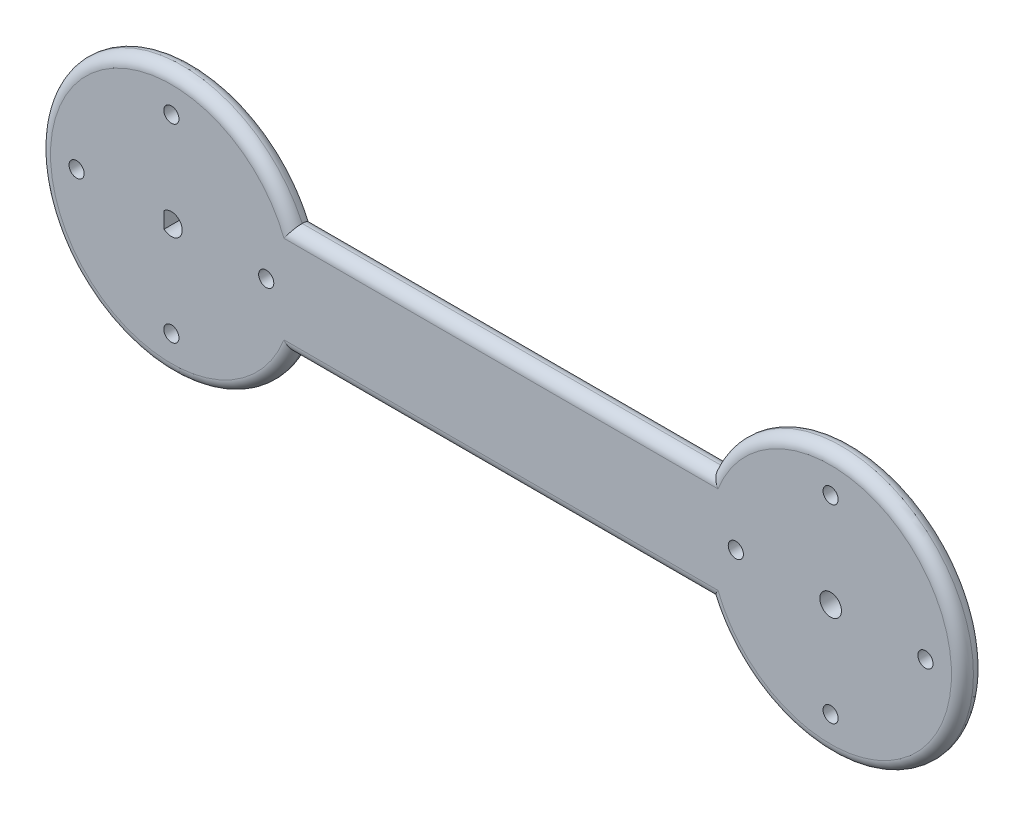
ISO-10303-21;
HEADER;
FILE_DESCRIPTION(('STEP AP214'),'2;1');
FILE_NAME('part.step','',(''),(''),'','','');
FILE_SCHEMA(('AUTOMOTIVE_DESIGN { 1 0 10303 214 1 1 1 1 }'));
ENDSEC;
DATA;
#1=APPLICATION_CONTEXT('core data for automotive mechanical design processes');
#2=APPLICATION_PROTOCOL_DEFINITION('international standard','automotive_design',2000,#1);
#3=PRODUCT_CONTEXT('',#1,'mechanical');
#4=PRODUCT('Part','Part','',(#3));
#5=PRODUCT_RELATED_PRODUCT_CATEGORY('part','',(#4));
#6=PRODUCT_DEFINITION_FORMATION('','',#4);
#7=PRODUCT_DEFINITION_CONTEXT('part definition',#1,'design');
#8=PRODUCT_DEFINITION('design','',#6,#7);
#9=PRODUCT_DEFINITION_SHAPE('','',#8);
#10=(LENGTH_UNIT() NAMED_UNIT(*) SI_UNIT(.MILLI.,.METRE.));
#11=(NAMED_UNIT(*) PLANE_ANGLE_UNIT() SI_UNIT($,.RADIAN.));
#12=(NAMED_UNIT(*) SI_UNIT($,.STERADIAN.) SOLID_ANGLE_UNIT());
#13=UNCERTAINTY_MEASURE_WITH_UNIT(LENGTH_MEASURE(1.E-05),#10,'distance_accuracy_value','');
#14=(GEOMETRIC_REPRESENTATION_CONTEXT(3) GLOBAL_UNCERTAINTY_ASSIGNED_CONTEXT((#13)) GLOBAL_UNIT_ASSIGNED_CONTEXT((#10,
#11,#12)) REPRESENTATION_CONTEXT('',''));
#15=CARTESIAN_POINT('',(0.,0.,0.));
#16=DIRECTION('',(0.,0.,1.));
#17=DIRECTION('',(1.,0.,0.));
#18=AXIS2_PLACEMENT_3D('',#15,#16,#17);
#19=CARTESIAN_POINT('',(152.4,0.,5.08));
#20=DIRECTION('',(0.,0.,1.));
#21=DIRECTION('',(1.,0.,0.));
#22=AXIS2_PLACEMENT_3D('',#19,#20,#21);
#23=PLANE('',#22);
#24=CARTESIAN_POINT('',(130.479689783217,0.,5.08));
#25=DIRECTION('',(0.,0.,-1.));
#26=DIRECTION('',(-1.,0.,0.));
#27=AXIS2_PLACEMENT_3D('',#24,#25,#26);
#28=CIRCLE('',#27,1.75000000000001);
#29=CARTESIAN_POINT('',(128.729689783217,0.,5.08));
#30=VERTEX_POINT('',#29);
#31=EDGE_CURVE('E307',#30,#30,#28,.T.);
#32=ORIENTED_EDGE('',*,*,#31,.T.);
#33=EDGE_LOOP('',(#32));
#34=FACE_BOUND('',#33,.T.);
#35=CARTESIAN_POINT('',(152.4,-21.920310216783,5.08));
#36=DIRECTION('',(0.,0.,-1.));
#37=DIRECTION('',(-1.,0.,0.));
#38=AXIS2_PLACEMENT_3D('',#35,#36,#37);
#39=CIRCLE('',#38,1.75);
#40=CARTESIAN_POINT('',(150.65,-21.920310216783,5.08));
#41=VERTEX_POINT('',#40);
#42=EDGE_CURVE('E315',#41,#41,#39,.T.);
#43=ORIENTED_EDGE('',*,*,#42,.T.);
#44=EDGE_LOOP('',(#43));
#45=FACE_BOUND('',#44,.T.);
#46=CARTESIAN_POINT('',(174.320310216783,1.530687081271E-13,5.08));
#47=DIRECTION('',(0.,0.,-1.));
#48=DIRECTION('',(-1.,0.,0.));
#49=AXIS2_PLACEMENT_3D('',#46,#47,#48);
#50=CIRCLE('',#49,1.75000000000001);
#51=CARTESIAN_POINT('',(172.570310216783,1.530687081271E-13,5.08));
#52=VERTEX_POINT('',#51);
#53=EDGE_CURVE('E323',#52,#52,#50,.T.);
#54=ORIENTED_EDGE('',*,*,#53,.T.);
#55=EDGE_LOOP('',(#54));
#56=FACE_BOUND('',#55,.T.);
#57=CARTESIAN_POINT('',(152.4,21.920310216783,5.08));
#58=DIRECTION('',(0.,0.,-1.));
#59=DIRECTION('',(-1.,0.,0.));
#60=AXIS2_PLACEMENT_3D('',#57,#58,#59);
#61=CIRCLE('',#60,1.75);
#62=CARTESIAN_POINT('',(150.65,21.920310216783,5.08));
#63=VERTEX_POINT('',#62);
#64=EDGE_CURVE('E331',#63,#63,#61,.T.);
#65=ORIENTED_EDGE('',*,*,#64,.T.);
#66=EDGE_LOOP('',(#65));
#67=FACE_BOUND('',#66,.T.);
#68=CARTESIAN_POINT('',(21.920310216783,0.,5.08));
#69=DIRECTION('',(0.,0.,1.));
#70=DIRECTION('',(1.,0.,0.));
#71=AXIS2_PLACEMENT_3D('',#68,#69,#70);
#72=CIRCLE('',#71,1.75000000000001);
#73=CARTESIAN_POINT('',(23.670310216783,0.,5.08));
#74=VERTEX_POINT('',#73);
#75=EDGE_CURVE('E278',#74,#74,#72,.T.);
#76=ORIENTED_EDGE('',*,*,#75,.F.);
#77=EDGE_LOOP('',(#76));
#78=FACE_BOUND('',#77,.T.);
#79=CARTESIAN_POINT('',(0.,-21.920310216783,5.08));
#80=DIRECTION('',(0.,0.,1.));
#81=DIRECTION('',(1.,0.,0.));
#82=AXIS2_PLACEMENT_3D('',#79,#80,#81);
#83=CIRCLE('',#82,1.75);
#84=CARTESIAN_POINT('',(1.74999999999992,-21.920310216783,5.08));
#85=VERTEX_POINT('',#84);
#86=EDGE_CURVE('E282',#85,#85,#83,.T.);
#87=ORIENTED_EDGE('',*,*,#86,.F.);
#88=EDGE_LOOP('',(#87));
#89=FACE_BOUND('',#88,.T.);
#90=CARTESIAN_POINT('',(-21.920310216783,1.530687081271E-13,5.08));
#91=DIRECTION('',(0.,0.,1.));
#92=DIRECTION('',(1.,0.,0.));
#93=AXIS2_PLACEMENT_3D('',#90,#91,#92);
#94=CIRCLE('',#93,1.75000000000001);
#95=CARTESIAN_POINT('',(-20.170310216783,1.530687081271E-13,5.08));
#96=VERTEX_POINT('',#95);
#97=EDGE_CURVE('E290',#96,#96,#94,.T.);
#98=ORIENTED_EDGE('',*,*,#97,.F.);
#99=EDGE_LOOP('',(#98));
#100=FACE_BOUND('',#99,.T.);
#101=CARTESIAN_POINT('',(2.16675014681188E-13,21.920310216783,5.08));
#102=DIRECTION('',(0.,0.,1.));
#103=DIRECTION('',(1.,0.,0.));
#104=AXIS2_PLACEMENT_3D('',#101,#102,#103);
#105=CIRCLE('',#104,1.75);
#106=CARTESIAN_POINT('',(1.75000000000022,21.920310216783,5.08));
#107=VERTEX_POINT('',#106);
#108=EDGE_CURVE('E298',#107,#107,#105,.T.);
#109=ORIENTED_EDGE('',*,*,#108,.F.);
#110=EDGE_LOOP('',(#109));
#111=FACE_BOUND('',#110,.T.);
#112=DIRECTION('',(-1.,0.,0.));
#113=VECTOR('',#112,1.);
#114=CARTESIAN_POINT('',(27.7081287711747,10.16,5.08));
#115=LINE('',#114,#113);
#116=CARTESIAN_POINT('',(126.372745054463,10.16,5.08));
#117=VERTEX_POINT('',#116);
#118=CARTESIAN_POINT('',(26.0272549455374,10.16,5.08));
#119=VERTEX_POINT('',#118);
#120=EDGE_CURVE('E162',#117,#119,#115,.T.);
#121=ORIENTED_EDGE('',*,*,#120,.T.);
#122=CARTESIAN_POINT('',(0.,0.,5.08));
#123=DIRECTION('',(0.,0.,1.));
#124=DIRECTION('',(1.,0.,0.));
#125=AXIS2_PLACEMENT_3D('',#122,#123,#124);
#126=CIRCLE('',#125,27.94);
#127=CARTESIAN_POINT('',(26.0272549455374,-10.16,5.08));
#128=VERTEX_POINT('',#127);
#129=EDGE_CURVE('E168',#119,#128,#126,.T.);
#130=ORIENTED_EDGE('',*,*,#129,.T.);
#131=DIRECTION('',(1.,0.,0.));
#132=VECTOR('',#131,1.);
#133=CARTESIAN_POINT('',(124.691871228825,-10.16,5.08));
#134=LINE('',#133,#132);
#135=CARTESIAN_POINT('',(126.372745054463,-10.16,5.08));
#136=VERTEX_POINT('',#135);
#137=EDGE_CURVE('E165',#128,#136,#134,.T.);
#138=ORIENTED_EDGE('',*,*,#137,.T.);
#139=CARTESIAN_POINT('',(152.4,0.,5.08));
#140=DIRECTION('',(0.,0.,1.));
#141=DIRECTION('',(1.,0.,0.));
#142=AXIS2_PLACEMENT_3D('',#139,#140,#141);
#143=CIRCLE('',#142,27.94);
#144=EDGE_CURVE('E156',#136,#117,#143,.T.);
#145=ORIENTED_EDGE('',*,*,#144,.T.);
#146=EDGE_LOOP('',(#121,#130,#138,#145));
#147=FACE_BOUND('',#146,.T.);
#148=CARTESIAN_POINT('',(152.4,0.,5.08));
#149=DIRECTION('',(0.,0.,1.));
#150=DIRECTION('',(1.,0.,0.));
#151=AXIS2_PLACEMENT_3D('',#148,#149,#150);
#152=CIRCLE('',#151,2.5019);
#153=CARTESIAN_POINT('',(154.9019,0.,5.08));
#154=VERTEX_POINT('',#153);
#155=EDGE_CURVE('E152',#154,#154,#152,.T.);
#156=ORIENTED_EDGE('',*,*,#155,.F.);
#157=EDGE_LOOP('',(#156));
#158=FACE_BOUND('',#157,.T.);
#159=DIRECTION('',(0.,-1.,0.));
#160=VECTOR('',#159,1.);
#161=CARTESIAN_POINT('',(-1.67829282995991,1.855488288,5.08));
#162=LINE('',#161,#160);
#163=CARTESIAN_POINT('',(-1.6782928299599,1.855488288,5.08));
#164=VERTEX_POINT('',#163);
#165=CARTESIAN_POINT('',(-1.67829282995991,-1.855488288,5.08));
#166=VERTEX_POINT('',#165);
#167=EDGE_CURVE('E118',#164,#166,#162,.T.);
#168=ORIENTED_EDGE('',*,*,#167,.F.);
#169=CARTESIAN_POINT('',(0.,0.,5.08));
#170=DIRECTION('',(0.,0.,1.));
#171=DIRECTION('',(1.,0.,0.));
#172=AXIS2_PLACEMENT_3D('',#169,#170,#171);
#173=CIRCLE('',#172,2.5019);
#174=EDGE_CURVE('E129',#166,#164,#173,.T.);
#175=ORIENTED_EDGE('',*,*,#174,.F.);
#176=EDGE_LOOP('',(#168,#175));
#177=FACE_BOUND('',#176,.T.);
#178=ADVANCED_FACE('F45',(#34,#45,#56,#67,#78,#89,#100,#111,#147,#158,#177),#23,.T.);
#179=CARTESIAN_POINT('',(152.4,0.,0.));
#180=DIRECTION('',(0.,0.,1.));
#181=DIRECTION('',(1.,0.,0.));
#182=AXIS2_PLACEMENT_3D('',#179,#180,#181);
#183=PLANE('',#182);
#184=CARTESIAN_POINT('',(130.479689783217,0.,0.));
#185=DIRECTION('',(0.,0.,-1.));
#186=DIRECTION('',(-1.,0.,0.));
#187=AXIS2_PLACEMENT_3D('',#184,#185,#186);
#188=CIRCLE('',#187,1.75000000000001);
#189=CARTESIAN_POINT('',(128.729689783217,0.,0.));
#190=VERTEX_POINT('',#189);
#191=EDGE_CURVE('E304',#190,#190,#188,.T.);
#192=ORIENTED_EDGE('',*,*,#191,.F.);
#193=EDGE_LOOP('',(#192));
#194=FACE_BOUND('',#193,.T.);
#195=CARTESIAN_POINT('',(152.4,-21.920310216783,0.));
#196=DIRECTION('',(0.,0.,-1.));
#197=DIRECTION('',(-1.,0.,0.));
#198=AXIS2_PLACEMENT_3D('',#195,#196,#197);
#199=CIRCLE('',#198,1.75);
#200=CARTESIAN_POINT('',(150.65,-21.920310216783,0.));
#201=VERTEX_POINT('',#200);
#202=EDGE_CURVE('E311',#201,#201,#199,.T.);
#203=ORIENTED_EDGE('',*,*,#202,.F.);
#204=EDGE_LOOP('',(#203));
#205=FACE_BOUND('',#204,.T.);
#206=CARTESIAN_POINT('',(174.320310216783,1.530687081271E-13,0.));
#207=DIRECTION('',(0.,0.,-1.));
#208=DIRECTION('',(-1.,0.,0.));
#209=AXIS2_PLACEMENT_3D('',#206,#207,#208);
#210=CIRCLE('',#209,1.75000000000001);
#211=CARTESIAN_POINT('',(172.570310216783,1.530687081271E-13,0.));
#212=VERTEX_POINT('',#211);
#213=EDGE_CURVE('E319',#212,#212,#210,.T.);
#214=ORIENTED_EDGE('',*,*,#213,.F.);
#215=EDGE_LOOP('',(#214));
#216=FACE_BOUND('',#215,.T.);
#217=CARTESIAN_POINT('',(152.4,21.920310216783,0.));
#218=DIRECTION('',(0.,0.,-1.));
#219=DIRECTION('',(-1.,0.,0.));
#220=AXIS2_PLACEMENT_3D('',#217,#218,#219);
#221=CIRCLE('',#220,1.75);
#222=CARTESIAN_POINT('',(150.65,21.920310216783,0.));
#223=VERTEX_POINT('',#222);
#224=EDGE_CURVE('E327',#223,#223,#221,.T.);
#225=ORIENTED_EDGE('',*,*,#224,.F.);
#226=EDGE_LOOP('',(#225));
#227=FACE_BOUND('',#226,.T.);
#228=CARTESIAN_POINT('',(21.920310216783,0.,0.));
#229=DIRECTION('',(0.,0.,1.));
#230=DIRECTION('',(1.,0.,0.));
#231=AXIS2_PLACEMENT_3D('',#228,#229,#230);
#232=CIRCLE('',#231,1.75000000000001);
#233=CARTESIAN_POINT('',(23.670310216783,0.,0.));
#234=VERTEX_POINT('',#233);
#235=EDGE_CURVE('E249',#234,#234,#232,.T.);
#236=ORIENTED_EDGE('',*,*,#235,.T.);
#237=EDGE_LOOP('',(#236));
#238=FACE_BOUND('',#237,.T.);
#239=CARTESIAN_POINT('',(0.,-21.920310216783,0.));
#240=DIRECTION('',(0.,0.,1.));
#241=DIRECTION('',(1.,0.,0.));
#242=AXIS2_PLACEMENT_3D('',#239,#240,#241);
#243=CIRCLE('',#242,1.75);
#244=CARTESIAN_POINT('',(1.74999999999992,-21.920310216783,0.));
#245=VERTEX_POINT('',#244);
#246=EDGE_CURVE('E286',#245,#245,#243,.T.);
#247=ORIENTED_EDGE('',*,*,#246,.T.);
#248=EDGE_LOOP('',(#247));
#249=FACE_BOUND('',#248,.T.);
#250=CARTESIAN_POINT('',(-21.920310216783,1.530687081271E-13,0.));
#251=DIRECTION('',(0.,0.,1.));
#252=DIRECTION('',(1.,0.,0.));
#253=AXIS2_PLACEMENT_3D('',#250,#251,#252);
#254=CIRCLE('',#253,1.75000000000001);
#255=CARTESIAN_POINT('',(-20.170310216783,1.530687081271E-13,0.));
#256=VERTEX_POINT('',#255);
#257=EDGE_CURVE('E294',#256,#256,#254,.T.);
#258=ORIENTED_EDGE('',*,*,#257,.T.);
#259=EDGE_LOOP('',(#258));
#260=FACE_BOUND('',#259,.T.);
#261=CARTESIAN_POINT('',(2.16675014681188E-13,21.920310216783,0.));
#262=DIRECTION('',(0.,0.,1.));
#263=DIRECTION('',(1.,0.,0.));
#264=AXIS2_PLACEMENT_3D('',#261,#262,#263);
#265=CIRCLE('',#264,1.75);
#266=CARTESIAN_POINT('',(1.75000000000022,21.920310216783,0.));
#267=VERTEX_POINT('',#266);
#268=EDGE_CURVE('E143',#267,#267,#265,.T.);
#269=ORIENTED_EDGE('',*,*,#268,.T.);
#270=EDGE_LOOP('',(#269));
#271=FACE_BOUND('',#270,.T.);
#272=CARTESIAN_POINT('',(152.4,0.,0.));
#273=DIRECTION('',(0.,0.,1.));
#274=DIRECTION('',(1.,0.,0.));
#275=AXIS2_PLACEMENT_3D('',#272,#273,#274);
#276=CIRCLE('',#275,27.94);
#277=CARTESIAN_POINT('',(126.372745054463,10.16,0.));
#278=VERTEX_POINT('',#277);
#279=CARTESIAN_POINT('',(126.372745054463,-10.16,0.));
#280=VERTEX_POINT('',#279);
#281=EDGE_CURVE('E187',#278,#280,#276,.F.);
#282=ORIENTED_EDGE('',*,*,#281,.T.);
#283=DIRECTION('',(1.,0.,0.));
#284=VECTOR('',#283,1.);
#285=CARTESIAN_POINT('',(152.4,-10.16,0.));
#286=LINE('',#285,#284);
#287=CARTESIAN_POINT('',(26.0272549455374,-10.16,0.));
#288=VERTEX_POINT('',#287);
#289=EDGE_CURVE('E11',#280,#288,#286,.F.);
#290=ORIENTED_EDGE('',*,*,#289,.T.);
#291=CARTESIAN_POINT('',(0.,0.,0.));
#292=DIRECTION('',(0.,0.,1.));
#293=DIRECTION('',(1.,0.,0.));
#294=AXIS2_PLACEMENT_3D('',#291,#292,#293);
#295=CIRCLE('',#294,27.94);
#296=CARTESIAN_POINT('',(26.0272549455374,10.16,0.));
#297=VERTEX_POINT('',#296);
#298=EDGE_CURVE('E60',#288,#297,#295,.F.);
#299=ORIENTED_EDGE('',*,*,#298,.T.);
#300=DIRECTION('',(-1.,0.,0.));
#301=VECTOR('',#300,1.);
#302=CARTESIAN_POINT('',(152.4,10.16,0.));
#303=LINE('',#302,#301);
#304=EDGE_CURVE('E236',#297,#278,#303,.F.);
#305=ORIENTED_EDGE('',*,*,#304,.T.);
#306=EDGE_LOOP('',(#282,#290,#299,#305));
#307=FACE_BOUND('',#306,.T.);
#308=CARTESIAN_POINT('',(152.4,0.,0.));
#309=DIRECTION('',(0.,0.,1.));
#310=DIRECTION('',(1.,0.,0.));
#311=AXIS2_PLACEMENT_3D('',#308,#309,#310);
#312=CIRCLE('',#311,2.5019);
#313=CARTESIAN_POINT('',(154.9019,0.,0.));
#314=VERTEX_POINT('',#313);
#315=EDGE_CURVE('E151',#314,#314,#312,.T.);
#316=ORIENTED_EDGE('',*,*,#315,.T.);
#317=EDGE_LOOP('',(#316));
#318=FACE_BOUND('',#317,.T.);
#319=CARTESIAN_POINT('',(0.,0.,0.));
#320=DIRECTION('',(0.,0.,1.));
#321=DIRECTION('',(1.,0.,0.));
#322=AXIS2_PLACEMENT_3D('',#319,#320,#321);
#323=CIRCLE('',#322,2.5019);
#324=CARTESIAN_POINT('',(-1.6782928299599,-1.855488288,0.));
#325=VERTEX_POINT('',#324);
#326=CARTESIAN_POINT('',(-1.67829282995991,1.855488288,0.));
#327=VERTEX_POINT('',#326);
#328=EDGE_CURVE('E134',#325,#327,#323,.T.);
#329=ORIENTED_EDGE('',*,*,#328,.T.);
#330=DIRECTION('',(0.,-1.,0.));
#331=VECTOR('',#330,1.);
#332=CARTESIAN_POINT('',(-1.67829282995991,1.855488288,0.));
#333=LINE('',#332,#331);
#334=EDGE_CURVE('E138',#327,#325,#333,.T.);
#335=ORIENTED_EDGE('',*,*,#334,.T.);
#336=EDGE_LOOP('',(#329,#335));
#337=FACE_BOUND('',#336,.T.);
#338=ADVANCED_FACE('F357',(#194,#205,#216,#227,#238,#249,#260,#271,#307,#318,#337),#183,.F.);
#339=CARTESIAN_POINT('',(152.4,0.,5.08));
#340=DIRECTION('',(0.,0.,-1.));
#341=DIRECTION('',(-1.,0.,0.));
#342=AXIS2_PLACEMENT_3D('',#339,#340,#341);
#343=CYLINDRICAL_SURFACE('',#342,2.5019);
#344=ORIENTED_EDGE('',*,*,#155,.T.);
#345=EDGE_LOOP('',(#344));
#346=FACE_BOUND('',#345,.T.);
#347=ORIENTED_EDGE('',*,*,#315,.F.);
#348=EDGE_LOOP('',(#347));
#349=FACE_BOUND('',#348,.T.);
#350=ADVANCED_FACE('F362',(#346,#349),#343,.F.);
#351=CARTESIAN_POINT('',(0.,0.,5.08));
#352=DIRECTION('',(0.,0.,-1.));
#353=DIRECTION('',(-1.,0.,0.));
#354=AXIS2_PLACEMENT_3D('',#351,#352,#353);
#355=CYLINDRICAL_SURFACE('',#354,2.5019);
#356=ORIENTED_EDGE('',*,*,#328,.F.);
#357=DIRECTION('',(0.,0.,-1.));
#358=VECTOR('',#357,1.);
#359=CARTESIAN_POINT('',(-1.67829282995991,-1.855488288,5.08));
#360=LINE('',#359,#358);
#361=EDGE_CURVE('E121',#166,#325,#360,.T.);
#362=ORIENTED_EDGE('',*,*,#361,.F.);
#363=ORIENTED_EDGE('',*,*,#174,.T.);
#364=DIRECTION('',(0.,0.,-1.));
#365=VECTOR('',#364,1.);
#366=CARTESIAN_POINT('',(-1.67829282995991,1.855488288,5.08));
#367=LINE('',#366,#365);
#368=EDGE_CURVE('E124',#164,#327,#367,.T.);
#369=ORIENTED_EDGE('',*,*,#368,.T.);
#370=EDGE_LOOP('',(#356,#362,#363,#369));
#371=FACE_BOUND('',#370,.T.);
#372=ADVANCED_FACE('F132',(#371),#355,.F.);
#373=CARTESIAN_POINT('',(-1.67829282995991,1.855488288,5.08));
#374=DIRECTION('',(1.,0.,0.));
#375=DIRECTION('',(0.,0.,-1.));
#376=AXIS2_PLACEMENT_3D('',#373,#374,#375);
#377=PLANE('',#376);
#378=ORIENTED_EDGE('',*,*,#334,.F.);
#379=ORIENTED_EDGE('',*,*,#368,.F.);
#380=ORIENTED_EDGE('',*,*,#167,.T.);
#381=ORIENTED_EDGE('',*,*,#361,.T.);
#382=EDGE_LOOP('',(#378,#379,#380,#381));
#383=FACE_BOUND('',#382,.T.);
#384=ADVANCED_FACE('F120',(#383),#377,.T.);
#385=CARTESIAN_POINT('',(152.4,0.,2.54));
#386=DIRECTION('',(0.,0.,1.));
#387=DIRECTION('',(1.,0.,0.));
#388=AXIS2_PLACEMENT_3D('',#385,#386,#387);
#389=TOROIDAL_SURFACE('',#388,27.94,2.54);
#390=CARTESIAN_POINT('',(124.691871228825,-12.7,2.54));
#391=CARTESIAN_POINT('',(124.691864341993,-12.7000115356829,2.60328584377885));
#392=CARTESIAN_POINT('',(124.693388770607,-12.6976351011673,2.66656496434905));
#393=CARTESIAN_POINT('',(124.699447359067,-12.6881945972125,2.79260449520955));
#394=CARTESIAN_POINT('',(124.703980392799,-12.6811322816883,2.85536509068719));
#395=CARTESIAN_POINT('',(124.715975040571,-12.6624523103007,2.97961697034155));
#396=CARTESIAN_POINT('',(124.723422755554,-12.6508562743545,3.04111284180102));
#397=CARTESIAN_POINT('',(124.741143047307,-12.6232814897666,3.16268385455268));
#398=CARTESIAN_POINT('',(124.751415769647,-12.6073025152764,3.22275892245894));
#399=CARTESIAN_POINT('',(124.786269979263,-12.5531254440636,3.40010225115658));
#400=CARTESIAN_POINT('',(124.814912235456,-12.5086485874664,3.51473893463433));
#401=CARTESIAN_POINT('',(124.881756977632,-12.4050671581032,3.73417225298285));
#402=CARTESIAN_POINT('',(124.919968739965,-12.3459483925923,3.83895920351377));
#403=CARTESIAN_POINT('',(125.00695392748,-12.2117148625325,4.04258589775835));
#404=CARTESIAN_POINT('',(125.056206008894,-12.135879222352,4.14074391227476));
#405=CARTESIAN_POINT('',(125.162148246232,-11.9732666186043,4.32285975905406));
#406=CARTESIAN_POINT('',(125.218839883909,-11.8864874755279,4.40681475482185));
#407=CARTESIAN_POINT('',(125.347103981389,-11.6908349121353,4.57146255445711));
#408=CARTESIAN_POINT('',(125.419633754454,-11.5805984860019,4.64978718484278));
#409=CARTESIAN_POINT('',(125.570607487601,-11.3521424806774,4.78681524333998));
#410=CARTESIAN_POINT('',(125.649059286561,-11.2339123427287,4.84549208547897));
#411=CARTESIAN_POINT('',(125.83124986032,-10.9606236136824,4.95612682110824));
#412=CARTESIAN_POINT('',(125.936224661702,-10.8040379751438,5.00228727213916));
#413=CARTESIAN_POINT('',(126.149653467066,-10.48765275387,5.06391542138454));
#414=CARTESIAN_POINT('',(126.25810006989,-10.3278602478771,5.07944449925286));
#415=CARTESIAN_POINT('',(126.368817976238,-10.1657489761241,5.07999512480699));
#416=CARTESIAN_POINT('',(126.370781469678,-10.1628743906443,5.08000000415135));
#417=CARTESIAN_POINT('',(126.372745054463,-10.16,5.08));
#418=B_SPLINE_CURVE_WITH_KNOTS('',3,(#390,#391,#392,#393,#394,#395,#396,#397,#398,#399,#400,
#401,#402,#403,#404,#405,#406,#407,#408,#409,#410,#411,#412,#413,#414,#415,#416,#417),
.UNSPECIFIED.,.F.,.F.,(4,2,2,2,2,2,2,2,2,2,2,2,2,4),(0.,0.189783378940336,0.379495762424577,
0.568314288919895,0.757142546878281,1.13404546907798,1.5113151718554,1.91013740338549,
2.30903919020432,2.76763387609431,3.22684661507338,3.80648660508857,4.38496391816577,
4.39540742364879),.UNSPECIFIED.);
#419=CARTESIAN_POINT('',(124.691871228825,-12.7,2.54));
#420=VERTEX_POINT('',#419);
#421=EDGE_CURVE('E229',#420,#136,#418,.T.);
#422=ORIENTED_EDGE('',*,*,#421,.F.);
#423=CARTESIAN_POINT('',(152.4,0.,2.54));
#424=DIRECTION('',(0.,0.,1.));
#425=DIRECTION('',(1.,0.,0.));
#426=AXIS2_PLACEMENT_3D('',#423,#424,#425);
#427=CIRCLE('',#426,30.48);
#428=CARTESIAN_POINT('',(124.691871228825,12.7,2.54));
#429=VERTEX_POINT('',#428);
#430=EDGE_CURVE('E183',#429,#420,#427,.F.);
#431=ORIENTED_EDGE('',*,*,#430,.F.);
#432=CARTESIAN_POINT('',(124.691871228825,12.7,2.54));
#433=CARTESIAN_POINT('',(124.691864341993,12.7000115356829,2.60328584377885));
#434=CARTESIAN_POINT('',(124.693388770607,12.6976351011673,2.66656496434905));
#435=CARTESIAN_POINT('',(124.699447359067,12.6881945972125,2.79260449520955));
#436=CARTESIAN_POINT('',(124.703980392799,12.6811322816883,2.85536509068719));
#437=CARTESIAN_POINT('',(124.715975040571,12.6624523103007,2.97961697034155));
#438=CARTESIAN_POINT('',(124.723422755554,12.6508562743545,3.04111284180102));
#439=CARTESIAN_POINT('',(124.741143047307,12.6232814897666,3.16268385455268));
#440=CARTESIAN_POINT('',(124.751415769647,12.6073025152764,3.22275892245894));
#441=CARTESIAN_POINT('',(124.786269979263,12.5531254440636,3.40010225115658));
#442=CARTESIAN_POINT('',(124.814912235456,12.5086485874664,3.51473893463433));
#443=CARTESIAN_POINT('',(124.881756977632,12.4050671581032,3.73417225298285));
#444=CARTESIAN_POINT('',(124.919968739965,12.3459483925923,3.83895920351377));
#445=CARTESIAN_POINT('',(125.00695392748,12.2117148625325,4.04258589775835));
#446=CARTESIAN_POINT('',(125.056206008894,12.135879222352,4.14074391227476));
#447=CARTESIAN_POINT('',(125.162148246232,11.9732666186043,4.32285975905406));
#448=CARTESIAN_POINT('',(125.218839883909,11.8864874755279,4.40681475482185));
#449=CARTESIAN_POINT('',(125.347103981389,11.6908349121353,4.57146255445711));
#450=CARTESIAN_POINT('',(125.419633754454,11.5805984860019,4.64978718484278));
#451=CARTESIAN_POINT('',(125.570607487601,11.3521424806774,4.78681524333998));
#452=CARTESIAN_POINT('',(125.649059286561,11.2339123427287,4.84549208547897));
#453=CARTESIAN_POINT('',(125.83124986032,10.9606236136824,4.95612682110824));
#454=CARTESIAN_POINT('',(125.936224661702,10.8040379751438,5.00228727213916));
#455=CARTESIAN_POINT('',(126.149653467066,10.48765275387,5.06391542138454));
#456=CARTESIAN_POINT('',(126.25810006989,10.3278602478771,5.07944449925286));
#457=CARTESIAN_POINT('',(126.368817976238,10.1657489761241,5.07999512480699));
#458=CARTESIAN_POINT('',(126.370781469678,10.1628743906443,5.08000000415135));
#459=CARTESIAN_POINT('',(126.372745054463,10.16,5.08));
#460=B_SPLINE_CURVE_WITH_KNOTS('',3,(#432,#433,#434,#435,#436,#437,#438,#439,#440,#441,#442,
#443,#444,#445,#446,#447,#448,#449,#450,#451,#452,#453,#454,#455,#456,#457,#458,#459),
.UNSPECIFIED.,.F.,.F.,(4,2,2,2,2,2,2,2,2,2,2,2,2,4),(0.,0.189783378940336,0.379495762424577,
0.568314288919895,0.757142546878281,1.13404546907798,1.5113151718554,1.91013740338549,
2.30903919020432,2.76763387609431,3.22684661507338,3.80648660508857,4.38496391816577,
4.39540742364879),.UNSPECIFIED.);
#461=EDGE_CURVE('E147',#117,#429,#460,.F.);
#462=ORIENTED_EDGE('',*,*,#461,.F.);
#463=ORIENTED_EDGE('',*,*,#144,.F.);
#464=EDGE_LOOP('',(#422,#431,#462,#463));
#465=FACE_BOUND('',#464,.T.);
#466=ADVANCED_FACE('F216',(#465),#389,.T.);
#467=CARTESIAN_POINT('',(152.4,10.16,2.54));
#468=DIRECTION('',(1.,0.,0.));
#469=DIRECTION('',(0.,0.,-1.));
#470=AXIS2_PLACEMENT_3D('',#467,#468,#469);
#471=CYLINDRICAL_SURFACE('',#470,2.54);
#472=ORIENTED_EDGE('',*,*,#461,.T.);
#473=DIRECTION('',(-1.,0.,0.));
#474=VECTOR('',#473,1.);
#475=CARTESIAN_POINT('',(124.691871228825,12.7,2.54));
#476=LINE('',#475,#474);
#477=CARTESIAN_POINT('',(27.7081287711747,12.7,2.54));
#478=VERTEX_POINT('',#477);
#479=EDGE_CURVE('E179',#478,#429,#476,.F.);
#480=ORIENTED_EDGE('',*,*,#479,.F.);
#481=CARTESIAN_POINT('',(27.7081287711747,12.7,2.54));
#482=CARTESIAN_POINT('',(27.708135658007,12.7000115356829,2.60328584377885));
#483=CARTESIAN_POINT('',(27.7066112293934,12.6976351011673,2.66656496434905));
#484=CARTESIAN_POINT('',(27.7005526409334,12.6881945972125,2.79260449520955));
#485=CARTESIAN_POINT('',(27.696019607201,12.6811322816883,2.85536509068719));
#486=CARTESIAN_POINT('',(27.6840249594295,12.6624523103007,2.97961697034155));
#487=CARTESIAN_POINT('',(27.676577244446,12.6508562743545,3.04111284180102));
#488=CARTESIAN_POINT('',(27.658856952693,12.6232814897666,3.16268385455268));
#489=CARTESIAN_POINT('',(27.6485842303535,12.6073025152764,3.22275892245894));
#490=CARTESIAN_POINT('',(27.6137300207366,12.5531254440636,3.40010225115658));
#491=CARTESIAN_POINT('',(27.5850877645442,12.5086485874664,3.51473893463432));
#492=CARTESIAN_POINT('',(27.5182430223681,12.4050671581032,3.73417225298285));
#493=CARTESIAN_POINT('',(27.4800312600348,12.3459483925923,3.83895920351376));
#494=CARTESIAN_POINT('',(27.3930460725201,12.2117148625325,4.04258589775835));
#495=CARTESIAN_POINT('',(27.3437939911058,12.135879222352,4.14074391227477));
#496=CARTESIAN_POINT('',(27.2378517537682,11.9732666186043,4.32285975905407));
#497=CARTESIAN_POINT('',(27.1811601160906,11.8864874755279,4.40681475482185));
#498=CARTESIAN_POINT('',(27.0528960186109,11.6908349121353,4.57146255445711));
#499=CARTESIAN_POINT('',(26.9803662455462,11.5805984860019,4.64978718484278));
#500=CARTESIAN_POINT('',(26.8293925123986,11.3521424806774,4.78681524333998));
#501=CARTESIAN_POINT('',(26.7509407134387,11.2339123427286,4.84549208547897));
#502=CARTESIAN_POINT('',(26.5687501396804,10.9606236136824,4.95612682110824));
#503=CARTESIAN_POINT('',(26.463775338298,10.8040379751439,5.00228727213915));
#504=CARTESIAN_POINT('',(26.2503465329339,10.4876527538699,5.06391542138454));
#505=CARTESIAN_POINT('',(26.1418999301108,10.3278602478765,5.07944449925288));
#506=CARTESIAN_POINT('',(26.0311820237625,10.1657489761241,5.07999512480699));
#507=CARTESIAN_POINT('',(26.0292185303225,10.1628743906443,5.08000000415135));
#508=CARTESIAN_POINT('',(26.0272549455374,10.16,5.08));
#509=B_SPLINE_CURVE_WITH_KNOTS('',3,(#481,#482,#483,#484,#485,#486,#487,#488,#489,#490,#491,
#492,#493,#494,#495,#496,#497,#498,#499,#500,#501,#502,#503,#504,#505,#506,#507,#508),
.UNSPECIFIED.,.F.,.F.,(4,2,2,2,2,2,2,2,2,2,2,2,2,4),(0.,0.189783378940336,0.379495762424576,
0.568314288919898,0.757142546878279,1.13404546907797,1.5113151718554,1.91013740338549,
2.30903919020433,2.76763387609431,3.22684661507337,3.80648660508857,4.38496391816578,
4.39540742364878),.UNSPECIFIED.);
#510=EDGE_CURVE('E197',#119,#478,#509,.F.);
#511=ORIENTED_EDGE('',*,*,#510,.F.);
#512=ORIENTED_EDGE('',*,*,#120,.F.);
#513=EDGE_LOOP('',(#472,#480,#511,#512));
#514=FACE_BOUND('',#513,.T.);
#515=ADVANCED_FACE('F211',(#514),#471,.T.);
#516=CARTESIAN_POINT('',(152.4,-10.16,2.54));
#517=DIRECTION('',(-1.,0.,0.));
#518=DIRECTION('',(0.,0.,1.));
#519=AXIS2_PLACEMENT_3D('',#516,#517,#518);
#520=CYLINDRICAL_SURFACE('',#519,2.54);
#521=ORIENTED_EDGE('',*,*,#421,.T.);
#522=ORIENTED_EDGE('',*,*,#137,.F.);
#523=CARTESIAN_POINT('',(27.7081287711747,-12.7,2.54));
#524=CARTESIAN_POINT('',(27.708135658007,-12.7000115356829,2.60328584377885));
#525=CARTESIAN_POINT('',(27.7066112293934,-12.6976351011673,2.66656496434905));
#526=CARTESIAN_POINT('',(27.7005526409334,-12.6881945972125,2.79260449520955));
#527=CARTESIAN_POINT('',(27.696019607201,-12.6811322816883,2.85536509068719));
#528=CARTESIAN_POINT('',(27.6840249594295,-12.6624523103007,2.97961697034155));
#529=CARTESIAN_POINT('',(27.676577244446,-12.6508562743545,3.04111284180102));
#530=CARTESIAN_POINT('',(27.658856952693,-12.6232814897666,3.16268385455268));
#531=CARTESIAN_POINT('',(27.6485842303535,-12.6073025152764,3.22275892245894));
#532=CARTESIAN_POINT('',(27.6137300207366,-12.5531254440636,3.40010225115658));
#533=CARTESIAN_POINT('',(27.5850877645442,-12.5086485874664,3.51473893463432));
#534=CARTESIAN_POINT('',(27.5182430223681,-12.4050671581032,3.73417225298285));
#535=CARTESIAN_POINT('',(27.4800312600348,-12.3459483925923,3.83895920351376));
#536=CARTESIAN_POINT('',(27.3930460725201,-12.2117148625325,4.04258589775834));
#537=CARTESIAN_POINT('',(27.3437939911058,-12.135879222352,4.14074391227476));
#538=CARTESIAN_POINT('',(27.2378517537682,-11.9732666186043,4.32285975905406));
#539=CARTESIAN_POINT('',(27.1811601160906,-11.8864874755279,4.40681475482185));
#540=CARTESIAN_POINT('',(27.0528960186109,-11.6908349121353,4.57146255445711));
#541=CARTESIAN_POINT('',(26.9803662455461,-11.5805984860019,4.64978718484278));
#542=CARTESIAN_POINT('',(26.8293925123986,-11.3521424806774,4.78681524333997));
#543=CARTESIAN_POINT('',(26.7509407134387,-11.2339123427286,4.84549208547897));
#544=CARTESIAN_POINT('',(26.5687501396804,-10.9606236136824,4.95612682110824));
#545=CARTESIAN_POINT('',(26.4637753382979,-10.804037975144,5.00228727213915));
#546=CARTESIAN_POINT('',(26.2503465329341,-10.4876527538698,5.06391542138454));
#547=CARTESIAN_POINT('',(26.1418999301113,-10.3278602478762,5.07944449925288));
#548=CARTESIAN_POINT('',(26.0311820237625,-10.1657489761241,5.07999512480699));
#549=CARTESIAN_POINT('',(26.0292185303225,-10.1628743906443,5.08000000415135));
#550=CARTESIAN_POINT('',(26.0272549455374,-10.16,5.08));
#551=B_SPLINE_CURVE_WITH_KNOTS('',3,(#523,#524,#525,#526,#527,#528,#529,#530,#531,#532,#533,
#534,#535,#536,#537,#538,#539,#540,#541,#542,#543,#544,#545,#546,#547,#548,#549,#550),
.UNSPECIFIED.,.F.,.F.,(4,2,2,2,2,2,2,2,2,2,2,2,2,4),(0.,0.189783378940336,0.379495762424576,
0.568314288919898,0.757142546878279,1.13404546907797,1.5113151718554,1.91013740338549,
2.30903919020433,2.76763387609431,3.22684661507337,3.80648660508857,4.38496391816578,
4.39540742364878),.UNSPECIFIED.);
#552=CARTESIAN_POINT('',(27.7081287711747,-12.7,2.54));
#553=VERTEX_POINT('',#552);
#554=EDGE_CURVE('E188',#553,#128,#551,.T.);
#555=ORIENTED_EDGE('',*,*,#554,.F.);
#556=DIRECTION('',(1.,0.,0.));
#557=VECTOR('',#556,1.);
#558=CARTESIAN_POINT('',(27.7081287711747,-12.7,2.54));
#559=LINE('',#558,#557);
#560=EDGE_CURVE('E176',#420,#553,#559,.F.);
#561=ORIENTED_EDGE('',*,*,#560,.F.);
#562=EDGE_LOOP('',(#521,#522,#555,#561));
#563=FACE_BOUND('',#562,.T.);
#564=ADVANCED_FACE('F204',(#563),#520,.T.);
#565=CARTESIAN_POINT('',(0.,0.,2.54));
#566=DIRECTION('',(0.,0.,1.));
#567=DIRECTION('',(1.,0.,0.));
#568=AXIS2_PLACEMENT_3D('',#565,#566,#567);
#569=TOROIDAL_SURFACE('',#568,27.94,2.54);
#570=ORIENTED_EDGE('',*,*,#510,.T.);
#571=CARTESIAN_POINT('',(0.,0.,2.54));
#572=DIRECTION('',(0.,0.,1.));
#573=DIRECTION('',(1.,0.,0.));
#574=AXIS2_PLACEMENT_3D('',#571,#572,#573);
#575=CIRCLE('',#574,30.48);
#576=EDGE_CURVE('E172',#553,#478,#575,.F.);
#577=ORIENTED_EDGE('',*,*,#576,.F.);
#578=ORIENTED_EDGE('',*,*,#554,.T.);
#579=ORIENTED_EDGE('',*,*,#129,.F.);
#580=EDGE_LOOP('',(#570,#577,#578,#579));
#581=FACE_BOUND('',#580,.T.);
#582=ADVANCED_FACE('F207',(#581),#569,.T.);
#583=CARTESIAN_POINT('',(27.7081287711747,10.16,2.54));
#584=DIRECTION('',(-1.,0.,0.));
#585=DIRECTION('',(0.,0.,1.));
#586=AXIS2_PLACEMENT_3D('',#583,#584,#585);
#587=CYLINDRICAL_SURFACE('',#586,2.54);
#588=CARTESIAN_POINT('',(124.691871228825,12.7,2.54));
#589=CARTESIAN_POINT('',(124.691864341993,12.7000115356829,2.47671415622115));
#590=CARTESIAN_POINT('',(124.693388770607,12.6976351011673,2.41343503565095));
#591=CARTESIAN_POINT('',(124.699447359067,12.6881945972125,2.28739550479045));
#592=CARTESIAN_POINT('',(124.703980392799,12.6811322816883,2.22463490931281));
#593=CARTESIAN_POINT('',(124.715975040571,12.6624523103007,2.10038302965845));
#594=CARTESIAN_POINT('',(124.723422755554,12.6508562743545,2.03888715819898));
#595=CARTESIAN_POINT('',(124.741143047307,12.6232814897666,1.91731614544732));
#596=CARTESIAN_POINT('',(124.751415769647,12.6073025152764,1.85724107754106));
#597=CARTESIAN_POINT('',(124.786269979263,12.5531254440636,1.67989774884342));
#598=CARTESIAN_POINT('',(124.814912235456,12.5086485874664,1.56526106536568));
#599=CARTESIAN_POINT('',(124.881756977632,12.4050671581032,1.34582774701715));
#600=CARTESIAN_POINT('',(124.919968739965,12.3459483925923,1.24104079648624));
#601=CARTESIAN_POINT('',(125.00695392748,12.2117148625325,1.03741410224165));
#602=CARTESIAN_POINT('',(125.056206008894,12.135879222352,0.939256087725236));
#603=CARTESIAN_POINT('',(125.162148246232,11.9732666186043,0.757140240945937));
#604=CARTESIAN_POINT('',(125.218839883909,11.8864874755279,0.673185245178147));
#605=CARTESIAN_POINT('',(125.347103981389,11.6908349121353,0.508537445542895));
#606=CARTESIAN_POINT('',(125.419633754454,11.5805984860019,0.430212815157226));
#607=CARTESIAN_POINT('',(125.570607487601,11.3521424806774,0.293184756660028));
#608=CARTESIAN_POINT('',(125.649059286561,11.2339123427286,0.234507914521028));
#609=CARTESIAN_POINT('',(125.83124986032,10.9606236136825,0.123873178891759));
#610=CARTESIAN_POINT('',(125.936224661703,10.8040379751443,0.0777127278608441));
#611=CARTESIAN_POINT('',(126.149653467066,10.4876527538695,0.0160845786154592));
#612=CARTESIAN_POINT('',(126.258100069887,10.3278602478751,0.000555500747130303));
#613=CARTESIAN_POINT('',(126.368817976238,10.165748976124,4.87519301449395E-06));
#614=CARTESIAN_POINT('',(126.370781469677,10.1628743906442,-4.15134988697351E-09));
#615=CARTESIAN_POINT('',(126.372745054463,10.16,0.));
#616=B_SPLINE_CURVE_WITH_KNOTS('',3,(#588,#589,#590,#591,#592,#593,#594,#595,#596,#597,#598,
#599,#600,#601,#602,#603,#604,#605,#606,#607,#608,#609,#610,#611,#612,#613,#614,#615),
.UNSPECIFIED.,.F.,.F.,(4,2,2,2,2,2,2,2,2,2,2,2,2,4),(0.,0.189783378940335,0.379495762424576,
0.568314288919895,0.75714254687828,1.13404546907797,1.5113151718554,1.91013740338549,
2.30903919020432,2.7676338760943,3.22684661507338,3.80648660508858,4.38496391816579,
4.39540742364878),.UNSPECIFIED.);
#617=EDGE_CURVE('E263',#278,#429,#616,.F.);
#618=ORIENTED_EDGE('',*,*,#617,.F.);
#619=ORIENTED_EDGE('',*,*,#304,.F.);
#620=CARTESIAN_POINT('',(27.7081287711747,12.7,2.54));
#621=CARTESIAN_POINT('',(27.708135658007,12.7000115356829,2.47671415622115));
#622=CARTESIAN_POINT('',(27.7066112293934,12.6976351011673,2.41343503565095));
#623=CARTESIAN_POINT('',(27.7005526409334,12.6881945972125,2.28739550479045));
#624=CARTESIAN_POINT('',(27.696019607201,12.6811322816883,2.22463490931281));
#625=CARTESIAN_POINT('',(27.6840249594295,12.6624523103007,2.10038302965845));
#626=CARTESIAN_POINT('',(27.676577244446,12.6508562743545,2.03888715819898));
#627=CARTESIAN_POINT('',(27.658856952693,12.6232814897666,1.91731614544732));
#628=CARTESIAN_POINT('',(27.6485842303535,12.6073025152764,1.85724107754106));
#629=CARTESIAN_POINT('',(27.6137300207366,12.5531254440636,1.67989774884342));
#630=CARTESIAN_POINT('',(27.5850877645442,12.5086485874664,1.56526106536568));
#631=CARTESIAN_POINT('',(27.5182430223681,12.4050671581032,1.34582774701715));
#632=CARTESIAN_POINT('',(27.4800312600348,12.3459483925923,1.24104079648624));
#633=CARTESIAN_POINT('',(27.3930460725201,12.2117148625325,1.03741410224165));
#634=CARTESIAN_POINT('',(27.3437939911058,12.135879222352,0.939256087725235));
#635=CARTESIAN_POINT('',(27.2378517537682,11.9732666186043,0.757140240945935));
#636=CARTESIAN_POINT('',(27.1811601160906,11.8864874755279,0.673185245178147));
#637=CARTESIAN_POINT('',(27.0528960186109,11.6908349121353,0.508537445542895));
#638=CARTESIAN_POINT('',(26.9803662455461,11.5805984860019,0.430212815157222));
#639=CARTESIAN_POINT('',(26.8293925123986,11.3521424806774,0.293184756660025));
#640=CARTESIAN_POINT('',(26.7509407134388,11.2339123427286,0.23450791452103));
#641=CARTESIAN_POINT('',(26.5687501396803,10.9606236136825,0.123873178891763));
#642=CARTESIAN_POINT('',(26.4637753382975,10.8040379751442,0.0777127278608461));
#643=CARTESIAN_POINT('',(26.2503465329344,10.4876527538696,0.0160845786154606));
#644=CARTESIAN_POINT('',(26.1418999301126,10.3278602478753,0.000555500747131531));
#645=CARTESIAN_POINT('',(26.0311820237625,10.165748976124,4.87519301453569E-06));
#646=CARTESIAN_POINT('',(26.0292185303225,10.1628743906442,-4.15134986659534E-09));
#647=CARTESIAN_POINT('',(26.0272549455374,10.16,0.));
#648=B_SPLINE_CURVE_WITH_KNOTS('',3,(#620,#621,#622,#623,#624,#625,#626,#627,#628,#629,#630,
#631,#632,#633,#634,#635,#636,#637,#638,#639,#640,#641,#642,#643,#644,#645,#646,#647),
.UNSPECIFIED.,.F.,.F.,(4,2,2,2,2,2,2,2,2,2,2,2,2,4),(0.,0.189783378940335,0.379495762424576,
0.568314288919899,0.757142546878279,1.13404546907797,1.5113151718554,1.91013740338549,
2.30903919020433,2.76763387609431,3.22684661507337,3.80648660508858,4.38496391816578,
4.39540742364878),.UNSPECIFIED.);
#649=EDGE_CURVE('E50',#478,#297,#648,.T.);
#650=ORIENTED_EDGE('',*,*,#649,.F.);
#651=ORIENTED_EDGE('',*,*,#479,.T.);
#652=EDGE_LOOP('',(#618,#619,#650,#651));
#653=FACE_BOUND('',#652,.T.);
#654=ADVANCED_FACE('F47',(#653),#587,.T.);
#655=CARTESIAN_POINT('',(0.,0.,2.54));
#656=DIRECTION('',(0.,0.,1.));
#657=DIRECTION('',(1.,0.,0.));
#658=AXIS2_PLACEMENT_3D('',#655,#656,#657);
#659=TOROIDAL_SURFACE('',#658,27.94,2.54);
#660=ORIENTED_EDGE('',*,*,#649,.T.);
#661=ORIENTED_EDGE('',*,*,#298,.F.);
#662=CARTESIAN_POINT('',(27.7081287711747,-12.7,2.54));
#663=CARTESIAN_POINT('',(27.708135658007,-12.7000115356829,2.47671415622115));
#664=CARTESIAN_POINT('',(27.7066112293934,-12.6976351011673,2.41343503565095));
#665=CARTESIAN_POINT('',(27.7005526409334,-12.6881945972125,2.28739550479045));
#666=CARTESIAN_POINT('',(27.696019607201,-12.6811322816883,2.22463490931281));
#667=CARTESIAN_POINT('',(27.6840249594295,-12.6624523103007,2.10038302965845));
#668=CARTESIAN_POINT('',(27.676577244446,-12.6508562743545,2.03888715819898));
#669=CARTESIAN_POINT('',(27.658856952693,-12.6232814897666,1.91731614544732));
#670=CARTESIAN_POINT('',(27.6485842303535,-12.6073025152764,1.85724107754106));
#671=CARTESIAN_POINT('',(27.6137300207366,-12.5531254440636,1.67989774884342));
#672=CARTESIAN_POINT('',(27.5850877645442,-12.5086485874664,1.56526106536568));
#673=CARTESIAN_POINT('',(27.5182430223681,-12.4050671581032,1.34582774701716));
#674=CARTESIAN_POINT('',(27.4800312600348,-12.3459483925923,1.24104079648624));
#675=CARTESIAN_POINT('',(27.3930460725201,-12.2117148625325,1.03741410224166));
#676=CARTESIAN_POINT('',(27.3437939911058,-12.135879222352,0.939256087725236));
#677=CARTESIAN_POINT('',(27.2378517537682,-11.9732666186043,0.757140240945936));
#678=CARTESIAN_POINT('',(27.1811601160906,-11.8864874755279,0.673185245178147));
#679=CARTESIAN_POINT('',(27.0528960186109,-11.6908349121353,0.508537445542894));
#680=CARTESIAN_POINT('',(26.9803662455462,-11.5805984860019,0.430212815157221));
#681=CARTESIAN_POINT('',(26.8293925123986,-11.3521424806774,0.293184756660025));
#682=CARTESIAN_POINT('',(26.7509407134387,-11.2339123427286,0.23450791452103));
#683=CARTESIAN_POINT('',(26.5687501396804,-10.9606236136824,0.123873178891763));
#684=CARTESIAN_POINT('',(26.463775338298,-10.804037975144,0.0777127278608472));
#685=CARTESIAN_POINT('',(26.250346532934,-10.4876527538698,0.0160845786154617));
#686=CARTESIAN_POINT('',(26.1418999301111,-10.3278602478763,0.000555500747133465));
#687=CARTESIAN_POINT('',(26.0311820237625,-10.1657489761241,4.87519301460249E-06));
#688=CARTESIAN_POINT('',(26.0292185303225,-10.1628743906443,-4.15134983373015E-09));
#689=CARTESIAN_POINT('',(26.0272549455374,-10.16,0.));
#690=B_SPLINE_CURVE_WITH_KNOTS('',3,(#662,#663,#664,#665,#666,#667,#668,#669,#670,#671,#672,
#673,#674,#675,#676,#677,#678,#679,#680,#681,#682,#683,#684,#685,#686,#687,#688,#689),
.UNSPECIFIED.,.F.,.F.,(4,2,2,2,2,2,2,2,2,2,2,2,2,4),(0.,0.189783378940335,0.379495762424575,
0.568314288919897,0.757142546878279,1.13404546907797,1.5113151718554,1.91013740338549,
2.30903919020433,2.76763387609431,3.22684661507337,3.80648660508857,4.38496391816578,
4.39540742364878),.UNSPECIFIED.);
#691=EDGE_CURVE('E68',#553,#288,#690,.T.);
#692=ORIENTED_EDGE('',*,*,#691,.F.);
#693=ORIENTED_EDGE('',*,*,#576,.T.);
#694=EDGE_LOOP('',(#660,#661,#692,#693));
#695=FACE_BOUND('',#694,.T.);
#696=ADVANCED_FACE('F259',(#695),#659,.T.);
#697=CARTESIAN_POINT('',(152.4,0.,2.54));
#698=DIRECTION('',(0.,0.,1.));
#699=DIRECTION('',(1.,0.,0.));
#700=AXIS2_PLACEMENT_3D('',#697,#698,#699);
#701=TOROIDAL_SURFACE('',#700,27.94,2.54);
#702=ORIENTED_EDGE('',*,*,#617,.T.);
#703=ORIENTED_EDGE('',*,*,#430,.T.);
#704=CARTESIAN_POINT('',(124.691871228825,-12.7,2.54));
#705=CARTESIAN_POINT('',(124.691864341993,-12.7000115356829,2.47671415622115));
#706=CARTESIAN_POINT('',(124.693388770607,-12.6976351011673,2.41343503565095));
#707=CARTESIAN_POINT('',(124.699447359067,-12.6881945972125,2.28739550479045));
#708=CARTESIAN_POINT('',(124.703980392799,-12.6811322816883,2.22463490931281));
#709=CARTESIAN_POINT('',(124.715975040571,-12.6624523103007,2.10038302965845));
#710=CARTESIAN_POINT('',(124.723422755554,-12.6508562743545,2.03888715819898));
#711=CARTESIAN_POINT('',(124.741143047307,-12.6232814897666,1.91731614544732));
#712=CARTESIAN_POINT('',(124.751415769647,-12.6073025152764,1.85724107754106));
#713=CARTESIAN_POINT('',(124.786269979263,-12.5531254440636,1.67989774884342));
#714=CARTESIAN_POINT('',(124.814912235456,-12.5086485874664,1.56526106536568));
#715=CARTESIAN_POINT('',(124.881756977632,-12.4050671581032,1.34582774701715));
#716=CARTESIAN_POINT('',(124.919968739965,-12.3459483925923,1.24104079648624));
#717=CARTESIAN_POINT('',(125.00695392748,-12.2117148625325,1.03741410224165));
#718=CARTESIAN_POINT('',(125.056206008894,-12.135879222352,0.939256087725236));
#719=CARTESIAN_POINT('',(125.162148246232,-11.9732666186043,0.757140240945937));
#720=CARTESIAN_POINT('',(125.218839883909,-11.8864874755279,0.673185245178147));
#721=CARTESIAN_POINT('',(125.347103981389,-11.6908349121353,0.508537445542895));
#722=CARTESIAN_POINT('',(125.419633754454,-11.5805984860019,0.430212815157226));
#723=CARTESIAN_POINT('',(125.570607487601,-11.3521424806774,0.293184756660028));
#724=CARTESIAN_POINT('',(125.649059286561,-11.2339123427286,0.234507914521028));
#725=CARTESIAN_POINT('',(125.83124986032,-10.9606236136825,0.123873178891759));
#726=CARTESIAN_POINT('',(125.936224661703,-10.8040379751443,0.0777127278608441));
#727=CARTESIAN_POINT('',(126.149653467066,-10.4876527538695,0.0160845786154592));
#728=CARTESIAN_POINT('',(126.258100069887,-10.3278602478751,0.000555500747130303));
#729=CARTESIAN_POINT('',(126.368817976238,-10.165748976124,4.87519301449395E-06));
#730=CARTESIAN_POINT('',(126.370781469677,-10.1628743906442,-4.15134988697351E-09));
#731=CARTESIAN_POINT('',(126.372745054463,-10.16,0.));
#732=B_SPLINE_CURVE_WITH_KNOTS('',3,(#704,#705,#706,#707,#708,#709,#710,#711,#712,#713,#714,
#715,#716,#717,#718,#719,#720,#721,#722,#723,#724,#725,#726,#727,#728,#729,#730,#731),
.UNSPECIFIED.,.F.,.F.,(4,2,2,2,2,2,2,2,2,2,2,2,2,4),(0.,0.189783378940335,0.379495762424576,
0.568314288919895,0.75714254687828,1.13404546907797,1.5113151718554,1.91013740338549,
2.30903919020432,2.7676338760943,3.22684661507338,3.80648660508858,4.38496391816579,
4.39540742364878),.UNSPECIFIED.);
#733=EDGE_CURVE('E241',#280,#420,#732,.F.);
#734=ORIENTED_EDGE('',*,*,#733,.F.);
#735=ORIENTED_EDGE('',*,*,#281,.F.);
#736=EDGE_LOOP('',(#702,#703,#734,#735));
#737=FACE_BOUND('',#736,.T.);
#738=ADVANCED_FACE('F256',(#737),#701,.T.);
#739=CARTESIAN_POINT('',(27.7081287711747,-10.16,2.54));
#740=DIRECTION('',(1.,0.,0.));
#741=DIRECTION('',(0.,0.,-1.));
#742=AXIS2_PLACEMENT_3D('',#739,#740,#741);
#743=CYLINDRICAL_SURFACE('',#742,2.54);
#744=ORIENTED_EDGE('',*,*,#691,.T.);
#745=ORIENTED_EDGE('',*,*,#289,.F.);
#746=ORIENTED_EDGE('',*,*,#733,.T.);
#747=ORIENTED_EDGE('',*,*,#560,.T.);
#748=EDGE_LOOP('',(#744,#745,#746,#747));
#749=FACE_BOUND('',#748,.T.);
#750=ADVANCED_FACE('F254',(#749),#743,.T.);
#751=CARTESIAN_POINT('',(2.16675014681188E-13,21.920310216783,0.));
#752=DIRECTION('',(0.,0.,1.));
#753=DIRECTION('',(1.,0.,0.));
#754=AXIS2_PLACEMENT_3D('',#751,#752,#753);
#755=CYLINDRICAL_SURFACE('',#754,1.75);
#756=ORIENTED_EDGE('',*,*,#268,.F.);
#757=EDGE_LOOP('',(#756));
#758=FACE_BOUND('',#757,.T.);
#759=ORIENTED_EDGE('',*,*,#108,.T.);
#760=EDGE_LOOP('',(#759));
#761=FACE_BOUND('',#760,.T.);
#762=ADVANCED_FACE('F373',(#758,#761),#755,.F.);
#763=CARTESIAN_POINT('',(-21.920310216783,1.530687081271E-13,0.));
#764=DIRECTION('',(0.,0.,1.));
#765=DIRECTION('',(1.,0.,0.));
#766=AXIS2_PLACEMENT_3D('',#763,#764,#765);
#767=CYLINDRICAL_SURFACE('',#766,1.75000000000001);
#768=ORIENTED_EDGE('',*,*,#257,.F.);
#769=EDGE_LOOP('',(#768));
#770=FACE_BOUND('',#769,.T.);
#771=ORIENTED_EDGE('',*,*,#97,.T.);
#772=EDGE_LOOP('',(#771));
#773=FACE_BOUND('',#772,.T.);
#774=ADVANCED_FACE('F376',(#770,#773),#767,.F.);
#775=CARTESIAN_POINT('',(0.,-21.920310216783,0.));
#776=DIRECTION('',(0.,0.,1.));
#777=DIRECTION('',(1.,0.,0.));
#778=AXIS2_PLACEMENT_3D('',#775,#776,#777);
#779=CYLINDRICAL_SURFACE('',#778,1.75);
#780=ORIENTED_EDGE('',*,*,#246,.F.);
#781=EDGE_LOOP('',(#780));
#782=FACE_BOUND('',#781,.T.);
#783=ORIENTED_EDGE('',*,*,#86,.T.);
#784=EDGE_LOOP('',(#783));
#785=FACE_BOUND('',#784,.T.);
#786=ADVANCED_FACE('F353',(#782,#785),#779,.F.);
#787=CARTESIAN_POINT('',(21.920310216783,0.,0.));
#788=DIRECTION('',(0.,0.,1.));
#789=DIRECTION('',(1.,0.,0.));
#790=AXIS2_PLACEMENT_3D('',#787,#788,#789);
#791=CYLINDRICAL_SURFACE('',#790,1.75000000000001);
#792=ORIENTED_EDGE('',*,*,#235,.F.);
#793=EDGE_LOOP('',(#792));
#794=FACE_BOUND('',#793,.T.);
#795=ORIENTED_EDGE('',*,*,#75,.T.);
#796=EDGE_LOOP('',(#795));
#797=FACE_BOUND('',#796,.T.);
#798=ADVANCED_FACE('F342',(#794,#797),#791,.F.);
#799=CARTESIAN_POINT('',(152.4,21.920310216783,0.));
#800=DIRECTION('',(0.,0.,1.));
#801=DIRECTION('',(1.,0.,0.));
#802=AXIS2_PLACEMENT_3D('',#799,#800,#801);
#803=CYLINDRICAL_SURFACE('',#802,1.75);
#804=ORIENTED_EDGE('',*,*,#224,.T.);
#805=EDGE_LOOP('',(#804));
#806=FACE_BOUND('',#805,.T.);
#807=ORIENTED_EDGE('',*,*,#64,.F.);
#808=EDGE_LOOP('',(#807));
#809=FACE_BOUND('',#808,.T.);
#810=ADVANCED_FACE('F339',(#806,#809),#803,.F.);
#811=CARTESIAN_POINT('',(174.320310216783,1.530687081271E-13,0.));
#812=DIRECTION('',(0.,0.,1.));
#813=DIRECTION('',(1.,0.,0.));
#814=AXIS2_PLACEMENT_3D('',#811,#812,#813);
#815=CYLINDRICAL_SURFACE('',#814,1.75000000000001);
#816=ORIENTED_EDGE('',*,*,#213,.T.);
#817=EDGE_LOOP('',(#816));
#818=FACE_BOUND('',#817,.T.);
#819=ORIENTED_EDGE('',*,*,#53,.F.);
#820=EDGE_LOOP('',(#819));
#821=FACE_BOUND('',#820,.T.);
#822=ADVANCED_FACE('F341',(#818,#821),#815,.F.);
#823=CARTESIAN_POINT('',(152.4,-21.920310216783,0.));
#824=DIRECTION('',(0.,0.,1.));
#825=DIRECTION('',(1.,0.,0.));
#826=AXIS2_PLACEMENT_3D('',#823,#824,#825);
#827=CYLINDRICAL_SURFACE('',#826,1.75);
#828=ORIENTED_EDGE('',*,*,#202,.T.);
#829=EDGE_LOOP('',(#828));
#830=FACE_BOUND('',#829,.T.);
#831=ORIENTED_EDGE('',*,*,#42,.F.);
#832=EDGE_LOOP('',(#831));
#833=FACE_BOUND('',#832,.T.);
#834=ADVANCED_FACE('F349',(#830,#833),#827,.F.);
#835=CARTESIAN_POINT('',(130.479689783217,0.,0.));
#836=DIRECTION('',(0.,0.,1.));
#837=DIRECTION('',(1.,0.,0.));
#838=AXIS2_PLACEMENT_3D('',#835,#836,#837);
#839=CYLINDRICAL_SURFACE('',#838,1.75000000000001);
#840=ORIENTED_EDGE('',*,*,#191,.T.);
#841=EDGE_LOOP('',(#840));
#842=FACE_BOUND('',#841,.T.);
#843=ORIENTED_EDGE('',*,*,#31,.F.);
#844=EDGE_LOOP('',(#843));
#845=FACE_BOUND('',#844,.T.);
#846=ADVANCED_FACE('F464',(#842,#845),#839,.F.);
#847=CLOSED_SHELL('',(#178,#338,#350,#372,#384,#466,#515,#564,#582,#654,#696,#738,#750,#762,
#774,#786,#798,#810,#822,#834,#846));
#848=MANIFOLD_SOLID_BREP('B2',#847);
#849=ADVANCED_BREP_SHAPE_REPRESENTATION('',(#18,#848),#14);
#850=SHAPE_DEFINITION_REPRESENTATION(#9,#849);
ENDSEC;
END-ISO-10303-21;
